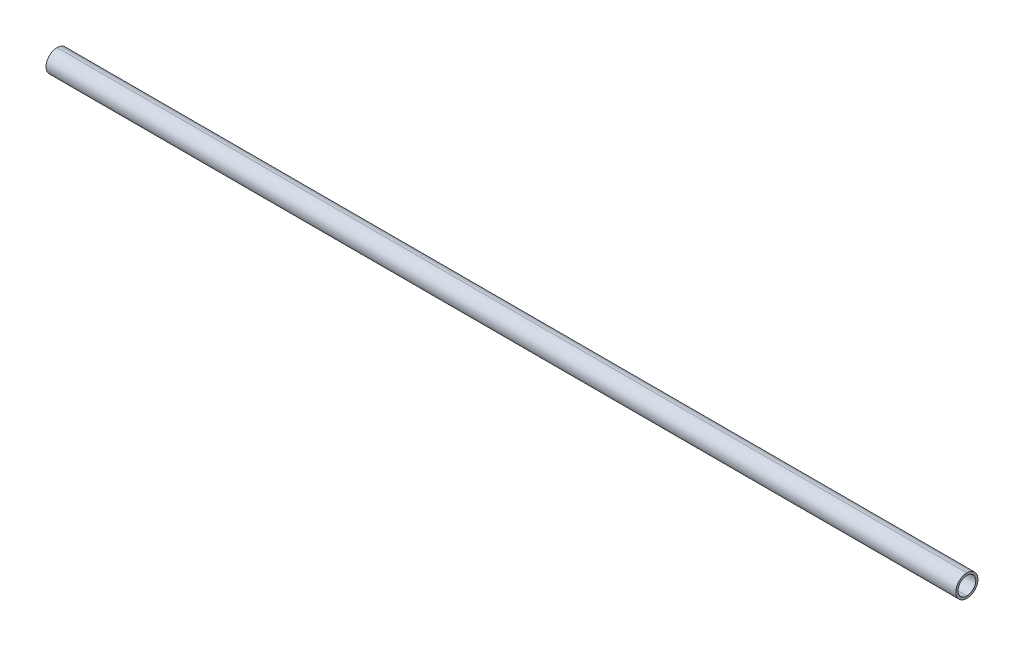
ISO-10303-21;
HEADER;
FILE_DESCRIPTION(('STEP AP214'),'2;1');
FILE_NAME('part.step','',(''),(''),'','','');
FILE_SCHEMA(('AUTOMOTIVE_DESIGN { 1 0 10303 214 1 1 1 1 }'));
ENDSEC;
DATA;
#1=APPLICATION_CONTEXT('core data for automotive mechanical design processes');
#2=APPLICATION_PROTOCOL_DEFINITION('international standard','automotive_design',2000,#1);
#3=PRODUCT_CONTEXT('',#1,'mechanical');
#4=PRODUCT('Part','Part','',(#3));
#5=PRODUCT_RELATED_PRODUCT_CATEGORY('part','',(#4));
#6=PRODUCT_DEFINITION_FORMATION('','',#4);
#7=PRODUCT_DEFINITION_CONTEXT('part definition',#1,'design');
#8=PRODUCT_DEFINITION('design','',#6,#7);
#9=PRODUCT_DEFINITION_SHAPE('','',#8);
#10=(LENGTH_UNIT() NAMED_UNIT(*) SI_UNIT(.MILLI.,.METRE.));
#11=(NAMED_UNIT(*) PLANE_ANGLE_UNIT() SI_UNIT($,.RADIAN.));
#12=(NAMED_UNIT(*) SI_UNIT($,.STERADIAN.) SOLID_ANGLE_UNIT());
#13=UNCERTAINTY_MEASURE_WITH_UNIT(LENGTH_MEASURE(1.E-05),#10,'distance_accuracy_value','');
#14=(GEOMETRIC_REPRESENTATION_CONTEXT(3) GLOBAL_UNCERTAINTY_ASSIGNED_CONTEXT((#13)) GLOBAL_UNIT_ASSIGNED_CONTEXT((#10,
#11,#12)) REPRESENTATION_CONTEXT('',''));
#15=CARTESIAN_POINT('',(0.,0.,0.));
#16=DIRECTION('',(0.,0.,1.));
#17=DIRECTION('',(1.,0.,0.));
#18=AXIS2_PLACEMENT_3D('',#15,#16,#17);
#19=CARTESIAN_POINT('',(0.,0.,0.));
#20=DIRECTION('',(1.,0.,0.));
#21=DIRECTION('',(0.,1.,0.));
#22=AXIS2_PLACEMENT_3D('',#19,#20,#21);
#23=CYLINDRICAL_SURFACE('',#22,5.);
#24=DIRECTION('',(1.,0.,0.));
#25=VECTOR('',#24,1.);
#26=CARTESIAN_POINT('',(0.,5.,0.));
#27=LINE('',#26,#25);
#28=CARTESIAN_POINT('',(-205.,5.,0.));
#29=VERTEX_POINT('',#28);
#30=CARTESIAN_POINT('',(205.,5.,0.));
#31=VERTEX_POINT('',#30);
#32=EDGE_CURVE('E11',#29,#31,#27,.T.);
#33=ORIENTED_EDGE('',*,*,#32,.F.);
#34=CARTESIAN_POINT('',(-205.,0.,0.));
#35=DIRECTION('',(1.,0.,0.));
#36=DIRECTION('',(0.,1.,0.));
#37=AXIS2_PLACEMENT_3D('',#34,#35,#36);
#38=CIRCLE('',#37,5.);
#39=CARTESIAN_POINT('',(-205.,-5.,0.));
#40=VERTEX_POINT('',#39);
#41=EDGE_CURVE('E19',#29,#40,#38,.T.);
#42=ORIENTED_EDGE('',*,*,#41,.T.);
#43=DIRECTION('',(1.,0.,0.));
#44=VECTOR('',#43,1.);
#45=CARTESIAN_POINT('',(0.,-5.,0.));
#46=LINE('',#45,#44);
#47=CARTESIAN_POINT('',(205.,-5.,0.));
#48=VERTEX_POINT('',#47);
#49=EDGE_CURVE('E26',#40,#48,#46,.T.);
#50=ORIENTED_EDGE('',*,*,#49,.T.);
#51=CARTESIAN_POINT('',(205.,0.,0.));
#52=DIRECTION('',(1.,0.,0.));
#53=DIRECTION('',(0.,1.,0.));
#54=AXIS2_PLACEMENT_3D('',#51,#52,#53);
#55=CIRCLE('',#54,5.);
#56=EDGE_CURVE('E90',#31,#48,#55,.T.);
#57=ORIENTED_EDGE('',*,*,#56,.F.);
#58=EDGE_LOOP('',(#33,#42,#50,#57));
#59=FACE_BOUND('',#58,.T.);
#60=ADVANCED_FACE('F16',(#59),#23,.T.);
#61=CARTESIAN_POINT('',(0.,0.,0.));
#62=DIRECTION('',(1.,0.,0.));
#63=DIRECTION('',(0.,1.,0.));
#64=AXIS2_PLACEMENT_3D('',#61,#62,#63);
#65=CYLINDRICAL_SURFACE('',#64,5.);
#66=ORIENTED_EDGE('',*,*,#49,.F.);
#67=CARTESIAN_POINT('',(-205.,0.,0.));
#68=DIRECTION('',(1.,0.,0.));
#69=DIRECTION('',(0.,1.,0.));
#70=AXIS2_PLACEMENT_3D('',#67,#68,#69);
#71=CIRCLE('',#70,5.);
#72=EDGE_CURVE('E86',#40,#29,#71,.T.);
#73=ORIENTED_EDGE('',*,*,#72,.T.);
#74=ORIENTED_EDGE('',*,*,#32,.T.);
#75=CARTESIAN_POINT('',(205.,0.,0.));
#76=DIRECTION('',(1.,0.,0.));
#77=DIRECTION('',(0.,1.,0.));
#78=AXIS2_PLACEMENT_3D('',#75,#76,#77);
#79=CIRCLE('',#78,5.);
#80=EDGE_CURVE('E83',#48,#31,#79,.T.);
#81=ORIENTED_EDGE('',*,*,#80,.F.);
#82=EDGE_LOOP('',(#66,#73,#74,#81));
#83=FACE_BOUND('',#82,.T.);
#84=ADVANCED_FACE('F82',(#83),#65,.T.);
#85=CARTESIAN_POINT('',(0.,0.,0.));
#86=DIRECTION('',(1.,0.,0.));
#87=DIRECTION('',(0.,1.,0.));
#88=AXIS2_PLACEMENT_3D('',#85,#86,#87);
#89=CYLINDRICAL_SURFACE('',#88,4.);
#90=CARTESIAN_POINT('',(205.,0.,0.));
#91=DIRECTION('',(1.,0.,0.));
#92=DIRECTION('',(0.,1.,0.));
#93=AXIS2_PLACEMENT_3D('',#90,#91,#92);
#94=CIRCLE('',#93,4.);
#95=CARTESIAN_POINT('',(205.,-4.,0.));
#96=VERTEX_POINT('',#95);
#97=CARTESIAN_POINT('',(205.,4.,0.));
#98=VERTEX_POINT('',#97);
#99=EDGE_CURVE('E92',#96,#98,#94,.T.);
#100=ORIENTED_EDGE('',*,*,#99,.T.);
#101=DIRECTION('',(1.,0.,0.));
#102=VECTOR('',#101,1.);
#103=CARTESIAN_POINT('',(0.,4.,0.));
#104=LINE('',#103,#102);
#105=CARTESIAN_POINT('',(-205.,4.,0.));
#106=VERTEX_POINT('',#105);
#107=EDGE_CURVE('E56',#106,#98,#104,.T.);
#108=ORIENTED_EDGE('',*,*,#107,.F.);
#109=CARTESIAN_POINT('',(-205.,0.,0.));
#110=DIRECTION('',(1.,0.,0.));
#111=DIRECTION('',(0.,1.,0.));
#112=AXIS2_PLACEMENT_3D('',#109,#110,#111);
#113=CIRCLE('',#112,4.);
#114=CARTESIAN_POINT('',(-205.,-4.,0.));
#115=VERTEX_POINT('',#114);
#116=EDGE_CURVE('E108',#115,#106,#113,.T.);
#117=ORIENTED_EDGE('',*,*,#116,.F.);
#118=DIRECTION('',(1.,0.,0.));
#119=VECTOR('',#118,1.);
#120=CARTESIAN_POINT('',(0.,-4.,0.));
#121=LINE('',#120,#119);
#122=EDGE_CURVE('E41',#115,#96,#121,.T.);
#123=ORIENTED_EDGE('',*,*,#122,.T.);
#124=EDGE_LOOP('',(#100,#108,#117,#123));
#125=FACE_BOUND('',#124,.T.);
#126=ADVANCED_FACE('F135',(#125),#89,.F.);
#127=CARTESIAN_POINT('',(0.,0.,0.));
#128=DIRECTION('',(1.,0.,0.));
#129=DIRECTION('',(0.,1.,0.));
#130=AXIS2_PLACEMENT_3D('',#127,#128,#129);
#131=CYLINDRICAL_SURFACE('',#130,4.);
#132=CARTESIAN_POINT('',(205.,0.,0.));
#133=DIRECTION('',(1.,0.,0.));
#134=DIRECTION('',(0.,1.,0.));
#135=AXIS2_PLACEMENT_3D('',#132,#133,#134);
#136=CIRCLE('',#135,4.);
#137=EDGE_CURVE('E118',#98,#96,#136,.T.);
#138=ORIENTED_EDGE('',*,*,#137,.T.);
#139=ORIENTED_EDGE('',*,*,#122,.F.);
#140=CARTESIAN_POINT('',(-205.,0.,0.));
#141=DIRECTION('',(1.,0.,0.));
#142=DIRECTION('',(0.,1.,0.));
#143=AXIS2_PLACEMENT_3D('',#140,#141,#142);
#144=CIRCLE('',#143,4.);
#145=EDGE_CURVE('E115',#106,#115,#144,.T.);
#146=ORIENTED_EDGE('',*,*,#145,.F.);
#147=ORIENTED_EDGE('',*,*,#107,.T.);
#148=EDGE_LOOP('',(#138,#139,#146,#147));
#149=FACE_BOUND('',#148,.T.);
#150=ADVANCED_FACE('F133',(#149),#131,.F.);
#151=CARTESIAN_POINT('',(-205.,0.,0.));
#152=DIRECTION('',(1.,0.,0.));
#153=DIRECTION('',(0.,1.,0.));
#154=AXIS2_PLACEMENT_3D('',#151,#152,#153);
#155=PLANE('',#154);
#156=ORIENTED_EDGE('',*,*,#145,.T.);
#157=ORIENTED_EDGE('',*,*,#116,.T.);
#158=EDGE_LOOP('',(#156,#157));
#159=FACE_BOUND('',#158,.T.);
#160=ORIENTED_EDGE('',*,*,#72,.F.);
#161=ORIENTED_EDGE('',*,*,#41,.F.);
#162=EDGE_LOOP('',(#160,#161));
#163=FACE_BOUND('',#162,.T.);
#164=ADVANCED_FACE('F131',(#159,#163),#155,.F.);
#165=CARTESIAN_POINT('',(205.,0.,0.));
#166=DIRECTION('',(1.,0.,0.));
#167=DIRECTION('',(0.,1.,0.));
#168=AXIS2_PLACEMENT_3D('',#165,#166,#167);
#169=PLANE('',#168);
#170=ORIENTED_EDGE('',*,*,#99,.F.);
#171=ORIENTED_EDGE('',*,*,#137,.F.);
#172=EDGE_LOOP('',(#170,#171));
#173=FACE_BOUND('',#172,.T.);
#174=ORIENTED_EDGE('',*,*,#56,.T.);
#175=ORIENTED_EDGE('',*,*,#80,.T.);
#176=EDGE_LOOP('',(#174,#175));
#177=FACE_BOUND('',#176,.T.);
#178=ADVANCED_FACE('F89',(#173,#177),#169,.T.);
#179=CLOSED_SHELL('',(#60,#84,#126,#150,#164,#178));
#180=MANIFOLD_SOLID_BREP('B1',#179);
#181=ADVANCED_BREP_SHAPE_REPRESENTATION('',(#18,#180),#14);
#182=SHAPE_DEFINITION_REPRESENTATION(#9,#181);
ENDSEC;
END-ISO-10303-21;
